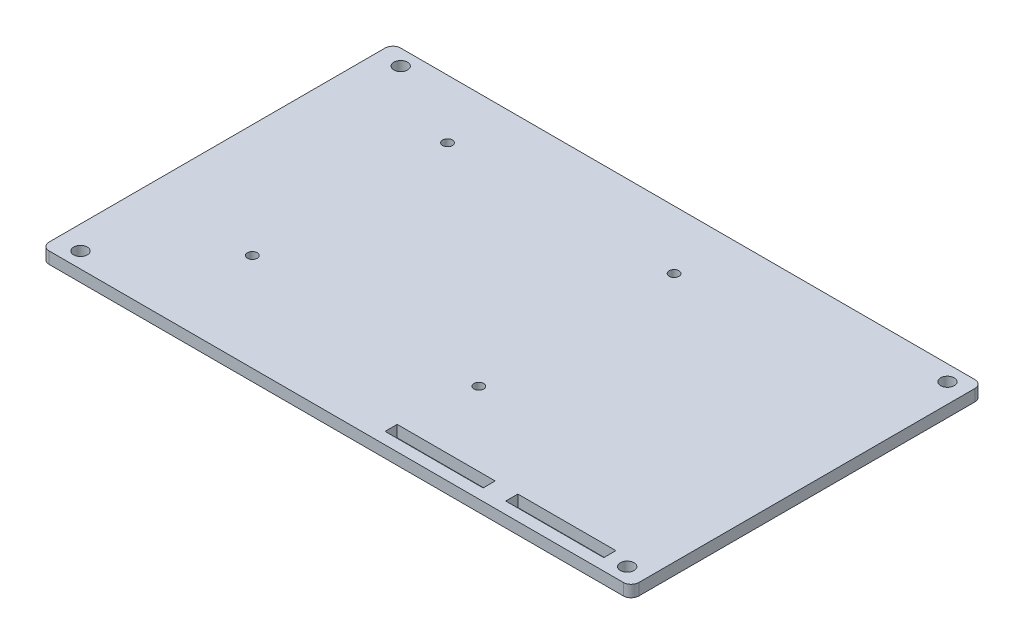
ISO-10303-21;
HEADER;
FILE_DESCRIPTION(('STEP AP214'),'2;1');
FILE_NAME('part.step','',(''),(''),'','','');
FILE_SCHEMA(('AUTOMOTIVE_DESIGN { 1 0 10303 214 1 1 1 1 }'));
ENDSEC;
DATA;
#1=APPLICATION_CONTEXT('core data for automotive mechanical design processes');
#2=APPLICATION_PROTOCOL_DEFINITION('international standard','automotive_design',2000,#1);
#3=PRODUCT_CONTEXT('',#1,'mechanical');
#4=PRODUCT('Part','Part','',(#3));
#5=PRODUCT_RELATED_PRODUCT_CATEGORY('part','',(#4));
#6=PRODUCT_DEFINITION_FORMATION('','',#4);
#7=PRODUCT_DEFINITION_CONTEXT('part definition',#1,'design');
#8=PRODUCT_DEFINITION('design','',#6,#7);
#9=PRODUCT_DEFINITION_SHAPE('','',#8);
#10=(LENGTH_UNIT() NAMED_UNIT(*) SI_UNIT(.MILLI.,.METRE.));
#11=(NAMED_UNIT(*) PLANE_ANGLE_UNIT() SI_UNIT($,.RADIAN.));
#12=(NAMED_UNIT(*) SI_UNIT($,.STERADIAN.) SOLID_ANGLE_UNIT());
#13=UNCERTAINTY_MEASURE_WITH_UNIT(LENGTH_MEASURE(1.E-05),#10,'distance_accuracy_value','');
#14=(GEOMETRIC_REPRESENTATION_CONTEXT(3) GLOBAL_UNCERTAINTY_ASSIGNED_CONTEXT((#13)) GLOBAL_UNIT_ASSIGNED_CONTEXT((#10,
#11,#12)) REPRESENTATION_CONTEXT('',''));
#15=CARTESIAN_POINT('',(0.,0.,0.));
#16=DIRECTION('',(0.,0.,1.));
#17=DIRECTION('',(1.,0.,0.));
#18=AXIS2_PLACEMENT_3D('',#15,#16,#17);
#19=CARTESIAN_POINT('',(0.,3.,0.));
#20=DIRECTION('',(1.,0.,0.));
#21=DIRECTION('',(0.,0.,-1.));
#22=AXIS2_PLACEMENT_3D('',#19,#20,#21);
#23=PLANE('',#22);
#24=DIRECTION('',(0.,0.,1.));
#25=VECTOR('',#24,1.);
#26=CARTESIAN_POINT('',(0.,0.,0.));
#27=LINE('',#26,#25);
#28=CARTESIAN_POINT('',(0.,0.,-88.));
#29=VERTEX_POINT('',#28);
#30=CARTESIAN_POINT('',(0.,0.,-2.));
#31=VERTEX_POINT('',#30);
#32=EDGE_CURVE('E317',#29,#31,#27,.T.);
#33=ORIENTED_EDGE('',*,*,#32,.T.);
#34=DIRECTION('',(0.,-1.,0.));
#35=VECTOR('',#34,1.);
#36=CARTESIAN_POINT('',(0.,3.,-2.));
#37=LINE('',#36,#35);
#38=CARTESIAN_POINT('',(0.,3.,-2.));
#39=VERTEX_POINT('',#38);
#40=EDGE_CURVE('E11',#31,#39,#37,.F.);
#41=ORIENTED_EDGE('',*,*,#40,.T.);
#42=DIRECTION('',(0.,0.,1.));
#43=VECTOR('',#42,1.);
#44=CARTESIAN_POINT('',(0.,3.,0.));
#45=LINE('',#44,#43);
#46=CARTESIAN_POINT('',(0.,3.,-88.));
#47=VERTEX_POINT('',#46);
#48=EDGE_CURVE('E321',#47,#39,#45,.T.);
#49=ORIENTED_EDGE('',*,*,#48,.F.);
#50=DIRECTION('',(0.,-1.,0.));
#51=VECTOR('',#50,1.);
#52=CARTESIAN_POINT('',(0.,3.,-88.));
#53=LINE('',#52,#51);
#54=EDGE_CURVE('E53',#47,#29,#53,.T.);
#55=ORIENTED_EDGE('',*,*,#54,.T.);
#56=EDGE_LOOP('',(#33,#41,#49,#55));
#57=FACE_BOUND('',#56,.T.);
#58=ADVANCED_FACE('F44',(#57),#23,.F.);
#59=CARTESIAN_POINT('',(0.,3.,0.));
#60=DIRECTION('',(0.,0.,-1.));
#61=DIRECTION('',(-1.,0.,0.));
#62=AXIS2_PLACEMENT_3D('',#59,#60,#61);
#63=PLANE('',#62);
#64=DIRECTION('',(1.,0.,0.));
#65=VECTOR('',#64,1.);
#66=CARTESIAN_POINT('',(0.,0.,0.));
#67=LINE('',#66,#65);
#68=CARTESIAN_POINT('',(2.,0.,0.));
#69=VERTEX_POINT('',#68);
#70=CARTESIAN_POINT('',(149.,0.,0.));
#71=VERTEX_POINT('',#70);
#72=EDGE_CURVE('E342',#69,#71,#67,.T.);
#73=ORIENTED_EDGE('',*,*,#72,.T.);
#74=DIRECTION('',(0.,-1.,0.));
#75=VECTOR('',#74,1.);
#76=CARTESIAN_POINT('',(149.,3.,0.));
#77=LINE('',#76,#75);
#78=CARTESIAN_POINT('',(149.,3.,0.));
#79=VERTEX_POINT('',#78);
#80=EDGE_CURVE('E394',#71,#79,#77,.F.);
#81=ORIENTED_EDGE('',*,*,#80,.T.);
#82=DIRECTION('',(1.,0.,0.));
#83=VECTOR('',#82,1.);
#84=CARTESIAN_POINT('',(0.,3.,0.));
#85=LINE('',#84,#83);
#86=CARTESIAN_POINT('',(2.,3.,0.));
#87=VERTEX_POINT('',#86);
#88=EDGE_CURVE('E325',#87,#79,#85,.T.);
#89=ORIENTED_EDGE('',*,*,#88,.F.);
#90=DIRECTION('',(0.,-1.,0.));
#91=VECTOR('',#90,1.);
#92=CARTESIAN_POINT('',(2.,3.,0.));
#93=LINE('',#92,#91);
#94=EDGE_CURVE('E390',#87,#69,#93,.T.);
#95=ORIENTED_EDGE('',*,*,#94,.T.);
#96=EDGE_LOOP('',(#73,#81,#89,#95));
#97=FACE_BOUND('',#96,.T.);
#98=ADVANCED_FACE('F414',(#97),#63,.F.);
#99=CARTESIAN_POINT('',(151.,3.,0.));
#100=DIRECTION('',(-1.,0.,0.));
#101=DIRECTION('',(0.,0.,1.));
#102=AXIS2_PLACEMENT_3D('',#99,#100,#101);
#103=PLANE('',#102);
#104=DIRECTION('',(0.,0.,-1.));
#105=VECTOR('',#104,1.);
#106=CARTESIAN_POINT('',(151.,0.,0.));
#107=LINE('',#106,#105);
#108=CARTESIAN_POINT('',(151.,0.,-2.));
#109=VERTEX_POINT('',#108);
#110=CARTESIAN_POINT('',(151.,0.,-88.));
#111=VERTEX_POINT('',#110);
#112=EDGE_CURVE('E346',#109,#111,#107,.T.);
#113=ORIENTED_EDGE('',*,*,#112,.T.);
#114=DIRECTION('',(0.,-1.,0.));
#115=VECTOR('',#114,1.);
#116=CARTESIAN_POINT('',(151.,3.,-88.));
#117=LINE('',#116,#115);
#118=CARTESIAN_POINT('',(151.,3.,-88.));
#119=VERTEX_POINT('',#118);
#120=EDGE_CURVE('E375',#111,#119,#117,.F.);
#121=ORIENTED_EDGE('',*,*,#120,.T.);
#122=DIRECTION('',(0.,0.,-1.));
#123=VECTOR('',#122,1.);
#124=CARTESIAN_POINT('',(151.,3.,0.));
#125=LINE('',#124,#123);
#126=CARTESIAN_POINT('',(151.,3.,-2.));
#127=VERTEX_POINT('',#126);
#128=EDGE_CURVE('E330',#127,#119,#125,.T.);
#129=ORIENTED_EDGE('',*,*,#128,.F.);
#130=DIRECTION('',(0.,-1.,0.));
#131=VECTOR('',#130,1.);
#132=CARTESIAN_POINT('',(151.,3.,-2.));
#133=LINE('',#132,#131);
#134=EDGE_CURVE('E371',#127,#109,#133,.T.);
#135=ORIENTED_EDGE('',*,*,#134,.T.);
#136=EDGE_LOOP('',(#113,#121,#129,#135));
#137=FACE_BOUND('',#136,.T.);
#138=ADVANCED_FACE('F425',(#137),#103,.F.);
#139=CARTESIAN_POINT('',(0.,3.,-90.));
#140=DIRECTION('',(0.,0.,1.));
#141=DIRECTION('',(1.,0.,0.));
#142=AXIS2_PLACEMENT_3D('',#139,#140,#141);
#143=PLANE('',#142);
#144=DIRECTION('',(-1.,0.,0.));
#145=VECTOR('',#144,1.);
#146=CARTESIAN_POINT('',(0.,3.,-90.));
#147=LINE('',#146,#145);
#148=CARTESIAN_POINT('',(149.,3.,-90.));
#149=VERTEX_POINT('',#148);
#150=CARTESIAN_POINT('',(2.,3.,-90.));
#151=VERTEX_POINT('',#150);
#152=EDGE_CURVE('E334',#149,#151,#147,.T.);
#153=ORIENTED_EDGE('',*,*,#152,.F.);
#154=DIRECTION('',(0.,-1.,0.));
#155=VECTOR('',#154,1.);
#156=CARTESIAN_POINT('',(149.,3.,-90.));
#157=LINE('',#156,#155);
#158=CARTESIAN_POINT('',(149.,0.,-90.));
#159=VERTEX_POINT('',#158);
#160=EDGE_CURVE('E355',#149,#159,#157,.T.);
#161=ORIENTED_EDGE('',*,*,#160,.T.);
#162=DIRECTION('',(-1.,0.,0.));
#163=VECTOR('',#162,1.);
#164=CARTESIAN_POINT('',(0.,0.,-90.));
#165=LINE('',#164,#163);
#166=CARTESIAN_POINT('',(2.,0.,-90.));
#167=VERTEX_POINT('',#166);
#168=EDGE_CURVE('E326',#159,#167,#165,.T.);
#169=ORIENTED_EDGE('',*,*,#168,.T.);
#170=DIRECTION('',(0.,-1.,0.));
#171=VECTOR('',#170,1.);
#172=CARTESIAN_POINT('',(2.,3.,-90.));
#173=LINE('',#172,#171);
#174=EDGE_CURVE('E338',#167,#151,#173,.F.);
#175=ORIENTED_EDGE('',*,*,#174,.T.);
#176=EDGE_LOOP('',(#153,#161,#169,#175));
#177=FACE_BOUND('',#176,.T.);
#178=ADVANCED_FACE('F433',(#177),#143,.F.);
#179=CARTESIAN_POINT('',(0.,3.,0.));
#180=DIRECTION('',(0.,-1.,0.));
#181=DIRECTION('',(0.,0.,-1.));
#182=AXIS2_PLACEMENT_3D('',#179,#180,#181);
#183=PLANE('',#182);
#184=DIRECTION('',(-1.,0.,0.));
#185=VECTOR('',#184,1.);
#186=CARTESIAN_POINT('',(0.,3.,-3.));
#187=LINE('',#186,#185);
#188=CARTESIAN_POINT('',(110.1,3.,-3.));
#189=VERTEX_POINT('',#188);
#190=CARTESIAN_POINT('',(85.,3.,-3.));
#191=VERTEX_POINT('',#190);
#192=EDGE_CURVE('E243',#189,#191,#187,.T.);
#193=ORIENTED_EDGE('',*,*,#192,.T.);
#194=DIRECTION('',(0.,0.,-1.));
#195=VECTOR('',#194,1.);
#196=CARTESIAN_POINT('',(85.,3.,0.));
#197=LINE('',#196,#195);
#198=CARTESIAN_POINT('',(85.,3.,-6.1));
#199=VERTEX_POINT('',#198);
#200=EDGE_CURVE('E162',#191,#199,#197,.T.);
#201=ORIENTED_EDGE('',*,*,#200,.T.);
#202=DIRECTION('',(1.,0.,0.));
#203=VECTOR('',#202,1.);
#204=CARTESIAN_POINT('',(0.,3.,-6.1));
#205=LINE('',#204,#203);
#206=CARTESIAN_POINT('',(110.1,3.,-6.1));
#207=VERTEX_POINT('',#206);
#208=EDGE_CURVE('E250',#199,#207,#205,.T.);
#209=ORIENTED_EDGE('',*,*,#208,.T.);
#210=DIRECTION('',(0.,0.,1.));
#211=VECTOR('',#210,1.);
#212=CARTESIAN_POINT('',(110.1,3.,0.));
#213=LINE('',#212,#211);
#214=EDGE_CURVE('E246',#207,#189,#213,.T.);
#215=ORIENTED_EDGE('',*,*,#214,.T.);
#216=EDGE_LOOP('',(#193,#201,#209,#215));
#217=FACE_BOUND('',#216,.T.);
#218=DIRECTION('',(1.,0.,0.));
#219=VECTOR('',#218,1.);
#220=CARTESIAN_POINT('',(0.,3.,-6.09999999999998));
#221=LINE('',#220,#219);
#222=CARTESIAN_POINT('',(115.9,3.,-6.1));
#223=VERTEX_POINT('',#222);
#224=CARTESIAN_POINT('',(141.,3.,-6.1));
#225=VERTEX_POINT('',#224);
#226=EDGE_CURVE('E196',#223,#225,#221,.T.);
#227=ORIENTED_EDGE('',*,*,#226,.T.);
#228=DIRECTION('',(0.,0.,1.));
#229=VECTOR('',#228,1.);
#230=CARTESIAN_POINT('',(141.,3.,0.));
#231=LINE('',#230,#229);
#232=CARTESIAN_POINT('',(141.,3.,-3.));
#233=VERTEX_POINT('',#232);
#234=EDGE_CURVE('E239',#225,#233,#231,.T.);
#235=ORIENTED_EDGE('',*,*,#234,.T.);
#236=DIRECTION('',(-1.,0.,0.));
#237=VECTOR('',#236,1.);
#238=CARTESIAN_POINT('',(0.,3.,-2.99999999999998));
#239=LINE('',#238,#237);
#240=CARTESIAN_POINT('',(115.9,3.,-3.));
#241=VERTEX_POINT('',#240);
#242=EDGE_CURVE('E235',#233,#241,#239,.T.);
#243=ORIENTED_EDGE('',*,*,#242,.T.);
#244=DIRECTION('',(0.,0.,-1.));
#245=VECTOR('',#244,1.);
#246=CARTESIAN_POINT('',(115.9,3.,0.));
#247=LINE('',#246,#245);
#248=EDGE_CURVE('E231',#241,#223,#247,.T.);
#249=ORIENTED_EDGE('',*,*,#248,.T.);
#250=EDGE_LOOP('',(#227,#235,#243,#249));
#251=FACE_BOUND('',#250,.T.);
#252=CARTESIAN_POINT('',(87.,3.,-25.));
#253=DIRECTION('',(0.,1.,0.));
#254=DIRECTION('',(0.,0.,1.));
#255=AXIS2_PLACEMENT_3D('',#252,#253,#254);
#256=CIRCLE('',#255,1.25);
#257=CARTESIAN_POINT('',(87.,3.,-23.75));
#258=VERTEX_POINT('',#257);
#259=EDGE_CURVE('E265',#258,#258,#256,.T.);
#260=ORIENTED_EDGE('',*,*,#259,.F.);
#261=EDGE_LOOP('',(#260));
#262=FACE_BOUND('',#261,.T.);
#263=CARTESIAN_POINT('',(29.,3.,-75.));
#264=DIRECTION('',(0.,1.,0.));
#265=DIRECTION('',(0.,0.,1.));
#266=AXIS2_PLACEMENT_3D('',#263,#264,#265);
#267=CIRCLE('',#266,1.25);
#268=CARTESIAN_POINT('',(29.,3.,-73.75));
#269=VERTEX_POINT('',#268);
#270=EDGE_CURVE('E274',#269,#269,#267,.T.);
#271=ORIENTED_EDGE('',*,*,#270,.F.);
#272=EDGE_LOOP('',(#271));
#273=FACE_BOUND('',#272,.T.);
#274=CARTESIAN_POINT('',(29.,3.,-25.));
#275=DIRECTION('',(0.,1.,0.));
#276=DIRECTION('',(0.,0.,1.));
#277=AXIS2_PLACEMENT_3D('',#274,#275,#276);
#278=CIRCLE('',#277,1.25);
#279=CARTESIAN_POINT('',(29.,3.,-23.75));
#280=VERTEX_POINT('',#279);
#281=EDGE_CURVE('E257',#280,#280,#278,.T.);
#282=ORIENTED_EDGE('',*,*,#281,.F.);
#283=EDGE_LOOP('',(#282));
#284=FACE_BOUND('',#283,.T.);
#285=CARTESIAN_POINT('',(87.,3.,-75.));
#286=DIRECTION('',(0.,1.,0.));
#287=DIRECTION('',(0.,0.,1.));
#288=AXIS2_PLACEMENT_3D('',#285,#286,#287);
#289=CIRCLE('',#288,1.25);
#290=CARTESIAN_POINT('',(87.,3.,-73.75));
#291=VERTEX_POINT('',#290);
#292=EDGE_CURVE('E269',#291,#291,#289,.T.);
#293=ORIENTED_EDGE('',*,*,#292,.F.);
#294=EDGE_LOOP('',(#293));
#295=FACE_BOUND('',#294,.T.);
#296=CARTESIAN_POINT('',(146.,3.,-4.));
#297=DIRECTION('',(0.,1.,0.));
#298=DIRECTION('',(0.,0.,1.));
#299=AXIS2_PLACEMENT_3D('',#296,#297,#298);
#300=CIRCLE('',#299,1.75000000000001);
#301=CARTESIAN_POINT('',(146.,3.,-2.24999999999999));
#302=VERTEX_POINT('',#301);
#303=EDGE_CURVE('E297',#302,#302,#300,.T.);
#304=ORIENTED_EDGE('',*,*,#303,.F.);
#305=EDGE_LOOP('',(#304));
#306=FACE_BOUND('',#305,.T.);
#307=CARTESIAN_POINT('',(6.,3.,-86.));
#308=DIRECTION('',(0.,1.,0.));
#309=DIRECTION('',(0.,0.,1.));
#310=AXIS2_PLACEMENT_3D('',#307,#308,#309);
#311=CIRCLE('',#310,1.75);
#312=CARTESIAN_POINT('',(6.,3.,-84.25));
#313=VERTEX_POINT('',#312);
#314=EDGE_CURVE('E306',#313,#313,#311,.T.);
#315=ORIENTED_EDGE('',*,*,#314,.F.);
#316=EDGE_LOOP('',(#315));
#317=FACE_BOUND('',#316,.T.);
#318=CARTESIAN_POINT('',(6.,3.,-4.));
#319=DIRECTION('',(0.,1.,0.));
#320=DIRECTION('',(0.,0.,1.));
#321=AXIS2_PLACEMENT_3D('',#318,#319,#320);
#322=CIRCLE('',#321,1.75);
#323=CARTESIAN_POINT('',(6.,3.,-2.25));
#324=VERTEX_POINT('',#323);
#325=EDGE_CURVE('E289',#324,#324,#322,.T.);
#326=ORIENTED_EDGE('',*,*,#325,.F.);
#327=EDGE_LOOP('',(#326));
#328=FACE_BOUND('',#327,.T.);
#329=CARTESIAN_POINT('',(146.,3.,-86.));
#330=DIRECTION('',(0.,1.,0.));
#331=DIRECTION('',(0.,0.,1.));
#332=AXIS2_PLACEMENT_3D('',#329,#330,#331);
#333=CIRCLE('',#332,1.75000000000001);
#334=CARTESIAN_POINT('',(146.,3.,-84.25));
#335=VERTEX_POINT('',#334);
#336=EDGE_CURVE('E301',#335,#335,#333,.T.);
#337=ORIENTED_EDGE('',*,*,#336,.F.);
#338=EDGE_LOOP('',(#337));
#339=FACE_BOUND('',#338,.T.);
#340=ORIENTED_EDGE('',*,*,#128,.T.);
#341=CARTESIAN_POINT('',(149.,3.,-88.));
#342=DIRECTION('',(0.,-1.,0.));
#343=DIRECTION('',(0.,0.,-1.));
#344=AXIS2_PLACEMENT_3D('',#341,#342,#343);
#345=CIRCLE('',#344,2.);
#346=EDGE_CURVE('E387',#119,#149,#345,.F.);
#347=ORIENTED_EDGE('',*,*,#346,.T.);
#348=ORIENTED_EDGE('',*,*,#152,.T.);
#349=CARTESIAN_POINT('',(2.,3.,-88.));
#350=DIRECTION('',(0.,-1.,0.));
#351=DIRECTION('',(0.,0.,-1.));
#352=AXIS2_PLACEMENT_3D('',#349,#350,#351);
#353=CIRCLE('',#352,2.);
#354=EDGE_CURVE('E378',#151,#47,#353,.F.);
#355=ORIENTED_EDGE('',*,*,#354,.T.);
#356=ORIENTED_EDGE('',*,*,#48,.T.);
#357=CARTESIAN_POINT('',(2.,3.,-2.));
#358=DIRECTION('',(0.,-1.,0.));
#359=DIRECTION('',(0.,0.,-1.));
#360=AXIS2_PLACEMENT_3D('',#357,#358,#359);
#361=CIRCLE('',#360,2.);
#362=EDGE_CURVE('E381',#39,#87,#361,.F.);
#363=ORIENTED_EDGE('',*,*,#362,.T.);
#364=ORIENTED_EDGE('',*,*,#88,.T.);
#365=CARTESIAN_POINT('',(149.,3.,-2.));
#366=DIRECTION('',(0.,-1.,0.));
#367=DIRECTION('',(0.,0.,-1.));
#368=AXIS2_PLACEMENT_3D('',#365,#366,#367);
#369=CIRCLE('',#368,2.);
#370=EDGE_CURVE('E384',#79,#127,#369,.F.);
#371=ORIENTED_EDGE('',*,*,#370,.T.);
#372=EDGE_LOOP('',(#340,#347,#348,#355,#356,#363,#364,#371));
#373=FACE_BOUND('',#372,.T.);
#374=ADVANCED_FACE('F418',(#217,#251,#262,#273,#284,#295,#306,#317,#328,#339,#373),#183,.F.);
#375=CARTESIAN_POINT('',(0.,0.,0.));
#376=DIRECTION('',(0.,-1.,0.));
#377=DIRECTION('',(0.,0.,-1.));
#378=AXIS2_PLACEMENT_3D('',#375,#376,#377);
#379=PLANE('',#378);
#380=DIRECTION('',(0.,0.,1.));
#381=VECTOR('',#380,1.);
#382=CARTESIAN_POINT('',(85.,0.,-3.));
#383=LINE('',#382,#381);
#384=CARTESIAN_POINT('',(85.,0.,-6.1));
#385=VERTEX_POINT('',#384);
#386=CARTESIAN_POINT('',(85.,0.,-3.));
#387=VERTEX_POINT('',#386);
#388=EDGE_CURVE('E159',#385,#387,#383,.T.);
#389=ORIENTED_EDGE('',*,*,#388,.T.);
#390=DIRECTION('',(1.,0.,0.));
#391=VECTOR('',#390,1.);
#392=CARTESIAN_POINT('',(85.,0.,-3.));
#393=LINE('',#392,#391);
#394=CARTESIAN_POINT('',(110.1,0.,-3.));
#395=VERTEX_POINT('',#394);
#396=EDGE_CURVE('E170',#387,#395,#393,.T.);
#397=ORIENTED_EDGE('',*,*,#396,.T.);
#398=DIRECTION('',(0.,0.,-1.));
#399=VECTOR('',#398,1.);
#400=CARTESIAN_POINT('',(110.1,0.,-3.));
#401=LINE('',#400,#399);
#402=CARTESIAN_POINT('',(110.1,0.,-6.1));
#403=VERTEX_POINT('',#402);
#404=EDGE_CURVE('E176',#395,#403,#401,.T.);
#405=ORIENTED_EDGE('',*,*,#404,.T.);
#406=DIRECTION('',(-1.,0.,0.));
#407=VECTOR('',#406,1.);
#408=CARTESIAN_POINT('',(85.,0.,-6.1));
#409=LINE('',#408,#407);
#410=EDGE_CURVE('E166',#403,#385,#409,.T.);
#411=ORIENTED_EDGE('',*,*,#410,.T.);
#412=EDGE_LOOP('',(#389,#397,#405,#411));
#413=FACE_BOUND('',#412,.T.);
#414=DIRECTION('',(0.,0.,-1.));
#415=VECTOR('',#414,1.);
#416=CARTESIAN_POINT('',(141.,0.,-3.));
#417=LINE('',#416,#415);
#418=CARTESIAN_POINT('',(141.,0.,-3.));
#419=VERTEX_POINT('',#418);
#420=CARTESIAN_POINT('',(141.,0.,-6.1));
#421=VERTEX_POINT('',#420);
#422=EDGE_CURVE('E182',#419,#421,#417,.T.);
#423=ORIENTED_EDGE('',*,*,#422,.T.);
#424=DIRECTION('',(-1.,0.,0.));
#425=VECTOR('',#424,1.);
#426=CARTESIAN_POINT('',(141.,0.,-6.1));
#427=LINE('',#426,#425);
#428=CARTESIAN_POINT('',(115.9,0.,-6.1));
#429=VERTEX_POINT('',#428);
#430=EDGE_CURVE('E186',#421,#429,#427,.T.);
#431=ORIENTED_EDGE('',*,*,#430,.T.);
#432=DIRECTION('',(0.,0.,1.));
#433=VECTOR('',#432,1.);
#434=CARTESIAN_POINT('',(115.9,0.,-3.));
#435=LINE('',#434,#433);
#436=CARTESIAN_POINT('',(115.9,0.,-3.));
#437=VERTEX_POINT('',#436);
#438=EDGE_CURVE('E221',#429,#437,#435,.T.);
#439=ORIENTED_EDGE('',*,*,#438,.T.);
#440=DIRECTION('',(1.,0.,0.));
#441=VECTOR('',#440,1.);
#442=CARTESIAN_POINT('',(141.,0.,-3.));
#443=LINE('',#442,#441);
#444=EDGE_CURVE('E205',#437,#419,#443,.T.);
#445=ORIENTED_EDGE('',*,*,#444,.T.);
#446=EDGE_LOOP('',(#423,#431,#439,#445));
#447=FACE_BOUND('',#446,.T.);
#448=CARTESIAN_POINT('',(87.,0.,-25.));
#449=DIRECTION('',(0.,1.,0.));
#450=DIRECTION('',(0.,0.,1.));
#451=AXIS2_PLACEMENT_3D('',#448,#449,#450);
#452=CIRCLE('',#451,1.25);
#453=CARTESIAN_POINT('',(87.,0.,-23.75));
#454=VERTEX_POINT('',#453);
#455=EDGE_CURVE('E270',#454,#454,#452,.T.);
#456=ORIENTED_EDGE('',*,*,#455,.T.);
#457=EDGE_LOOP('',(#456));
#458=FACE_BOUND('',#457,.T.);
#459=CARTESIAN_POINT('',(29.,0.,-75.));
#460=DIRECTION('',(0.,1.,0.));
#461=DIRECTION('',(0.,0.,1.));
#462=AXIS2_PLACEMENT_3D('',#459,#460,#461);
#463=CIRCLE('',#462,1.25);
#464=CARTESIAN_POINT('',(29.,0.,-73.75));
#465=VERTEX_POINT('',#464);
#466=EDGE_CURVE('E261',#465,#465,#463,.T.);
#467=ORIENTED_EDGE('',*,*,#466,.T.);
#468=EDGE_LOOP('',(#467));
#469=FACE_BOUND('',#468,.T.);
#470=CARTESIAN_POINT('',(29.,0.,-25.));
#471=DIRECTION('',(0.,1.,0.));
#472=DIRECTION('',(0.,0.,1.));
#473=AXIS2_PLACEMENT_3D('',#470,#471,#472);
#474=CIRCLE('',#473,1.25);
#475=CARTESIAN_POINT('',(29.,0.,-23.75));
#476=VERTEX_POINT('',#475);
#477=EDGE_CURVE('E256',#476,#476,#474,.T.);
#478=ORIENTED_EDGE('',*,*,#477,.T.);
#479=EDGE_LOOP('',(#478));
#480=FACE_BOUND('',#479,.T.);
#481=CARTESIAN_POINT('',(87.,0.,-75.));
#482=DIRECTION('',(0.,1.,0.));
#483=DIRECTION('',(0.,0.,1.));
#484=AXIS2_PLACEMENT_3D('',#481,#482,#483);
#485=CIRCLE('',#484,1.25);
#486=CARTESIAN_POINT('',(87.,0.,-73.75));
#487=VERTEX_POINT('',#486);
#488=EDGE_CURVE('E281',#487,#487,#485,.T.);
#489=ORIENTED_EDGE('',*,*,#488,.T.);
#490=EDGE_LOOP('',(#489));
#491=FACE_BOUND('',#490,.T.);
#492=CARTESIAN_POINT('',(146.,0.,-4.));
#493=DIRECTION('',(0.,1.,0.));
#494=DIRECTION('',(0.,0.,1.));
#495=AXIS2_PLACEMENT_3D('',#492,#493,#494);
#496=CIRCLE('',#495,1.75000000000001);
#497=CARTESIAN_POINT('',(146.,0.,-2.24999999999999));
#498=VERTEX_POINT('',#497);
#499=EDGE_CURVE('E302',#498,#498,#496,.T.);
#500=ORIENTED_EDGE('',*,*,#499,.T.);
#501=EDGE_LOOP('',(#500));
#502=FACE_BOUND('',#501,.T.);
#503=CARTESIAN_POINT('',(6.,0.,-86.));
#504=DIRECTION('',(0.,1.,0.));
#505=DIRECTION('',(0.,0.,1.));
#506=AXIS2_PLACEMENT_3D('',#503,#504,#505);
#507=CIRCLE('',#506,1.75);
#508=CARTESIAN_POINT('',(6.,0.,-84.25));
#509=VERTEX_POINT('',#508);
#510=EDGE_CURVE('E293',#509,#509,#507,.T.);
#511=ORIENTED_EDGE('',*,*,#510,.T.);
#512=EDGE_LOOP('',(#511));
#513=FACE_BOUND('',#512,.T.);
#514=CARTESIAN_POINT('',(6.,0.,-4.));
#515=DIRECTION('',(0.,1.,0.));
#516=DIRECTION('',(0.,0.,1.));
#517=AXIS2_PLACEMENT_3D('',#514,#515,#516);
#518=CIRCLE('',#517,1.75);
#519=CARTESIAN_POINT('',(6.,0.,-2.25));
#520=VERTEX_POINT('',#519);
#521=EDGE_CURVE('E285',#520,#520,#518,.T.);
#522=ORIENTED_EDGE('',*,*,#521,.T.);
#523=EDGE_LOOP('',(#522));
#524=FACE_BOUND('',#523,.T.);
#525=CARTESIAN_POINT('',(146.,0.,-86.));
#526=DIRECTION('',(0.,1.,0.));
#527=DIRECTION('',(0.,0.,1.));
#528=AXIS2_PLACEMENT_3D('',#525,#526,#527);
#529=CIRCLE('',#528,1.75000000000001);
#530=CARTESIAN_POINT('',(146.,0.,-84.25));
#531=VERTEX_POINT('',#530);
#532=EDGE_CURVE('E313',#531,#531,#529,.T.);
#533=ORIENTED_EDGE('',*,*,#532,.T.);
#534=EDGE_LOOP('',(#533));
#535=FACE_BOUND('',#534,.T.);
#536=ORIENTED_EDGE('',*,*,#168,.F.);
#537=CARTESIAN_POINT('',(149.,0.,-88.));
#538=DIRECTION('',(0.,-1.,0.));
#539=DIRECTION('',(0.,0.,-1.));
#540=AXIS2_PLACEMENT_3D('',#537,#538,#539);
#541=CIRCLE('',#540,2.);
#542=EDGE_CURVE('E368',#159,#111,#541,.T.);
#543=ORIENTED_EDGE('',*,*,#542,.T.);
#544=ORIENTED_EDGE('',*,*,#112,.F.);
#545=CARTESIAN_POINT('',(149.,0.,-2.));
#546=DIRECTION('',(0.,-1.,0.));
#547=DIRECTION('',(0.,0.,-1.));
#548=AXIS2_PLACEMENT_3D('',#545,#546,#547);
#549=CIRCLE('',#548,2.);
#550=EDGE_CURVE('E365',#109,#71,#549,.T.);
#551=ORIENTED_EDGE('',*,*,#550,.T.);
#552=ORIENTED_EDGE('',*,*,#72,.F.);
#553=CARTESIAN_POINT('',(2.,0.,-2.));
#554=DIRECTION('',(0.,-1.,0.));
#555=DIRECTION('',(0.,0.,-1.));
#556=AXIS2_PLACEMENT_3D('',#553,#554,#555);
#557=CIRCLE('',#556,2.);
#558=EDGE_CURVE('E362',#69,#31,#557,.T.);
#559=ORIENTED_EDGE('',*,*,#558,.T.);
#560=ORIENTED_EDGE('',*,*,#32,.F.);
#561=CARTESIAN_POINT('',(2.,0.,-88.));
#562=DIRECTION('',(0.,-1.,0.));
#563=DIRECTION('',(0.,0.,-1.));
#564=AXIS2_PLACEMENT_3D('',#561,#562,#563);
#565=CIRCLE('',#564,2.);
#566=EDGE_CURVE('E359',#29,#167,#565,.T.);
#567=ORIENTED_EDGE('',*,*,#566,.T.);
#568=EDGE_LOOP('',(#536,#543,#544,#551,#552,#559,#560,#567));
#569=FACE_BOUND('',#568,.T.);
#570=ADVANCED_FACE('F178',(#413,#447,#458,#469,#480,#491,#502,#513,#524,#535,#569),#379,.T.);
#571=CARTESIAN_POINT('',(146.,0.,-86.));
#572=DIRECTION('',(0.,1.,0.));
#573=DIRECTION('',(0.,0.,1.));
#574=AXIS2_PLACEMENT_3D('',#571,#572,#573);
#575=CYLINDRICAL_SURFACE('',#574,1.75000000000001);
#576=ORIENTED_EDGE('',*,*,#532,.F.);
#577=EDGE_LOOP('',(#576));
#578=FACE_BOUND('',#577,.T.);
#579=ORIENTED_EDGE('',*,*,#336,.T.);
#580=EDGE_LOOP('',(#579));
#581=FACE_BOUND('',#580,.T.);
#582=ADVANCED_FACE('F592',(#578,#581),#575,.F.);
#583=CARTESIAN_POINT('',(6.,0.,-4.));
#584=DIRECTION('',(0.,1.,0.));
#585=DIRECTION('',(0.,0.,1.));
#586=AXIS2_PLACEMENT_3D('',#583,#584,#585);
#587=CYLINDRICAL_SURFACE('',#586,1.75);
#588=ORIENTED_EDGE('',*,*,#521,.F.);
#589=EDGE_LOOP('',(#588));
#590=FACE_BOUND('',#589,.T.);
#591=ORIENTED_EDGE('',*,*,#325,.T.);
#592=EDGE_LOOP('',(#591));
#593=FACE_BOUND('',#592,.T.);
#594=ADVANCED_FACE('F588',(#590,#593),#587,.F.);
#595=CARTESIAN_POINT('',(6.,0.,-86.));
#596=DIRECTION('',(0.,1.,0.));
#597=DIRECTION('',(0.,0.,1.));
#598=AXIS2_PLACEMENT_3D('',#595,#596,#597);
#599=CYLINDRICAL_SURFACE('',#598,1.75);
#600=ORIENTED_EDGE('',*,*,#510,.F.);
#601=EDGE_LOOP('',(#600));
#602=FACE_BOUND('',#601,.T.);
#603=ORIENTED_EDGE('',*,*,#314,.T.);
#604=EDGE_LOOP('',(#603));
#605=FACE_BOUND('',#604,.T.);
#606=ADVANCED_FACE('F591',(#602,#605),#599,.F.);
#607=CARTESIAN_POINT('',(146.,0.,-4.));
#608=DIRECTION('',(0.,1.,0.));
#609=DIRECTION('',(0.,0.,1.));
#610=AXIS2_PLACEMENT_3D('',#607,#608,#609);
#611=CYLINDRICAL_SURFACE('',#610,1.75000000000001);
#612=ORIENTED_EDGE('',*,*,#499,.F.);
#613=EDGE_LOOP('',(#612));
#614=FACE_BOUND('',#613,.T.);
#615=ORIENTED_EDGE('',*,*,#303,.T.);
#616=EDGE_LOOP('',(#615));
#617=FACE_BOUND('',#616,.T.);
#618=ADVANCED_FACE('F455',(#614,#617),#611,.F.);
#619=CARTESIAN_POINT('',(149.,3.,-88.));
#620=DIRECTION('',(0.,-1.,0.));
#621=DIRECTION('',(0.,0.,-1.));
#622=AXIS2_PLACEMENT_3D('',#619,#620,#621);
#623=CYLINDRICAL_SURFACE('',#622,2.);
#624=ORIENTED_EDGE('',*,*,#346,.F.);
#625=ORIENTED_EDGE('',*,*,#120,.F.);
#626=ORIENTED_EDGE('',*,*,#542,.F.);
#627=ORIENTED_EDGE('',*,*,#160,.F.);
#628=EDGE_LOOP('',(#624,#625,#626,#627));
#629=FACE_BOUND('',#628,.T.);
#630=ADVANCED_FACE('F430',(#629),#623,.T.);
#631=CARTESIAN_POINT('',(149.,3.,-2.));
#632=DIRECTION('',(0.,-1.,0.));
#633=DIRECTION('',(0.,0.,-1.));
#634=AXIS2_PLACEMENT_3D('',#631,#632,#633);
#635=CYLINDRICAL_SURFACE('',#634,2.);
#636=ORIENTED_EDGE('',*,*,#370,.F.);
#637=ORIENTED_EDGE('',*,*,#80,.F.);
#638=ORIENTED_EDGE('',*,*,#550,.F.);
#639=ORIENTED_EDGE('',*,*,#134,.F.);
#640=EDGE_LOOP('',(#636,#637,#638,#639));
#641=FACE_BOUND('',#640,.T.);
#642=ADVANCED_FACE('F422',(#641),#635,.T.);
#643=CARTESIAN_POINT('',(2.,3.,-2.));
#644=DIRECTION('',(0.,-1.,0.));
#645=DIRECTION('',(0.,0.,-1.));
#646=AXIS2_PLACEMENT_3D('',#643,#644,#645);
#647=CYLINDRICAL_SURFACE('',#646,2.);
#648=ORIENTED_EDGE('',*,*,#362,.F.);
#649=ORIENTED_EDGE('',*,*,#40,.F.);
#650=ORIENTED_EDGE('',*,*,#558,.F.);
#651=ORIENTED_EDGE('',*,*,#94,.F.);
#652=EDGE_LOOP('',(#648,#649,#650,#651));
#653=FACE_BOUND('',#652,.T.);
#654=ADVANCED_FACE('F411',(#653),#647,.T.);
#655=CARTESIAN_POINT('',(2.,3.,-88.));
#656=DIRECTION('',(0.,-1.,0.));
#657=DIRECTION('',(0.,0.,-1.));
#658=AXIS2_PLACEMENT_3D('',#655,#656,#657);
#659=CYLINDRICAL_SURFACE('',#658,2.);
#660=ORIENTED_EDGE('',*,*,#354,.F.);
#661=ORIENTED_EDGE('',*,*,#174,.F.);
#662=ORIENTED_EDGE('',*,*,#566,.F.);
#663=ORIENTED_EDGE('',*,*,#54,.F.);
#664=EDGE_LOOP('',(#660,#661,#662,#663));
#665=FACE_BOUND('',#664,.T.);
#666=ADVANCED_FACE('F46',(#665),#659,.T.);
#667=CARTESIAN_POINT('',(87.,0.,-75.));
#668=DIRECTION('',(0.,1.,0.));
#669=DIRECTION('',(0.,0.,1.));
#670=AXIS2_PLACEMENT_3D('',#667,#668,#669);
#671=CYLINDRICAL_SURFACE('',#670,1.25);
#672=ORIENTED_EDGE('',*,*,#488,.F.);
#673=EDGE_LOOP('',(#672));
#674=FACE_BOUND('',#673,.T.);
#675=ORIENTED_EDGE('',*,*,#292,.T.);
#676=EDGE_LOOP('',(#675));
#677=FACE_BOUND('',#676,.T.);
#678=ADVANCED_FACE('F436',(#674,#677),#671,.F.);
#679=CARTESIAN_POINT('',(29.,0.,-25.));
#680=DIRECTION('',(0.,1.,0.));
#681=DIRECTION('',(0.,0.,1.));
#682=AXIS2_PLACEMENT_3D('',#679,#680,#681);
#683=CYLINDRICAL_SURFACE('',#682,1.25);
#684=ORIENTED_EDGE('',*,*,#477,.F.);
#685=EDGE_LOOP('',(#684));
#686=FACE_BOUND('',#685,.T.);
#687=ORIENTED_EDGE('',*,*,#281,.T.);
#688=EDGE_LOOP('',(#687));
#689=FACE_BOUND('',#688,.T.);
#690=ADVANCED_FACE('F441',(#686,#689),#683,.F.);
#691=CARTESIAN_POINT('',(29.,0.,-75.));
#692=DIRECTION('',(0.,1.,0.));
#693=DIRECTION('',(0.,0.,1.));
#694=AXIS2_PLACEMENT_3D('',#691,#692,#693);
#695=CYLINDRICAL_SURFACE('',#694,1.25);
#696=ORIENTED_EDGE('',*,*,#466,.F.);
#697=EDGE_LOOP('',(#696));
#698=FACE_BOUND('',#697,.T.);
#699=ORIENTED_EDGE('',*,*,#270,.T.);
#700=EDGE_LOOP('',(#699));
#701=FACE_BOUND('',#700,.T.);
#702=ADVANCED_FACE('F487',(#698,#701),#695,.F.);
#703=CARTESIAN_POINT('',(87.,0.,-25.));
#704=DIRECTION('',(0.,1.,0.));
#705=DIRECTION('',(0.,0.,1.));
#706=AXIS2_PLACEMENT_3D('',#703,#704,#705);
#707=CYLINDRICAL_SURFACE('',#706,1.25);
#708=ORIENTED_EDGE('',*,*,#455,.F.);
#709=EDGE_LOOP('',(#708));
#710=FACE_BOUND('',#709,.T.);
#711=ORIENTED_EDGE('',*,*,#259,.T.);
#712=EDGE_LOOP('',(#711));
#713=FACE_BOUND('',#712,.T.);
#714=ADVANCED_FACE('F497',(#710,#713),#707,.F.);
#715=CARTESIAN_POINT('',(141.,0.,-3.));
#716=DIRECTION('',(1.,0.,0.));
#717=DIRECTION('',(0.,0.,-1.));
#718=AXIS2_PLACEMENT_3D('',#715,#716,#717);
#719=PLANE('',#718);
#720=DIRECTION('',(0.,1.,0.));
#721=VECTOR('',#720,1.);
#722=CARTESIAN_POINT('',(141.,0.,-6.1));
#723=LINE('',#722,#721);
#724=EDGE_CURVE('E68',#421,#225,#723,.T.);
#725=ORIENTED_EDGE('',*,*,#724,.F.);
#726=ORIENTED_EDGE('',*,*,#422,.F.);
#727=DIRECTION('',(0.,1.,0.));
#728=VECTOR('',#727,1.);
#729=CARTESIAN_POINT('',(141.,0.,-3.));
#730=LINE('',#729,#728);
#731=EDGE_CURVE('E214',#419,#233,#730,.T.);
#732=ORIENTED_EDGE('',*,*,#731,.T.);
#733=ORIENTED_EDGE('',*,*,#234,.F.);
#734=EDGE_LOOP('',(#725,#726,#732,#733));
#735=FACE_BOUND('',#734,.T.);
#736=ADVANCED_FACE('F507',(#735),#719,.F.);
#737=CARTESIAN_POINT('',(141.,0.,-3.));
#738=DIRECTION('',(0.,0.,1.));
#739=DIRECTION('',(1.,0.,0.));
#740=AXIS2_PLACEMENT_3D('',#737,#738,#739);
#741=PLANE('',#740);
#742=ORIENTED_EDGE('',*,*,#731,.F.);
#743=ORIENTED_EDGE('',*,*,#444,.F.);
#744=DIRECTION('',(0.,1.,0.));
#745=VECTOR('',#744,1.);
#746=CARTESIAN_POINT('',(115.9,0.,-3.));
#747=LINE('',#746,#745);
#748=EDGE_CURVE('E210',#437,#241,#747,.T.);
#749=ORIENTED_EDGE('',*,*,#748,.T.);
#750=ORIENTED_EDGE('',*,*,#242,.F.);
#751=EDGE_LOOP('',(#742,#743,#749,#750));
#752=FACE_BOUND('',#751,.T.);
#753=ADVANCED_FACE('F518',(#752),#741,.F.);
#754=CARTESIAN_POINT('',(115.9,0.,-3.));
#755=DIRECTION('',(-1.,0.,0.));
#756=DIRECTION('',(0.,0.,1.));
#757=AXIS2_PLACEMENT_3D('',#754,#755,#756);
#758=PLANE('',#757);
#759=ORIENTED_EDGE('',*,*,#748,.F.);
#760=ORIENTED_EDGE('',*,*,#438,.F.);
#761=DIRECTION('',(0.,1.,0.));
#762=VECTOR('',#761,1.);
#763=CARTESIAN_POINT('',(115.9,0.,-6.1));
#764=LINE('',#763,#762);
#765=EDGE_CURVE('E206',#429,#223,#764,.T.);
#766=ORIENTED_EDGE('',*,*,#765,.T.);
#767=ORIENTED_EDGE('',*,*,#248,.F.);
#768=EDGE_LOOP('',(#759,#760,#766,#767));
#769=FACE_BOUND('',#768,.T.);
#770=ADVANCED_FACE('F529',(#769),#758,.F.);
#771=CARTESIAN_POINT('',(141.,0.,-6.1));
#772=DIRECTION('',(0.,0.,-1.));
#773=DIRECTION('',(-1.,0.,0.));
#774=AXIS2_PLACEMENT_3D('',#771,#772,#773);
#775=PLANE('',#774);
#776=ORIENTED_EDGE('',*,*,#765,.F.);
#777=ORIENTED_EDGE('',*,*,#430,.F.);
#778=ORIENTED_EDGE('',*,*,#724,.T.);
#779=ORIENTED_EDGE('',*,*,#226,.F.);
#780=EDGE_LOOP('',(#776,#777,#778,#779));
#781=FACE_BOUND('',#780,.T.);
#782=ADVANCED_FACE('F539',(#781),#775,.F.);
#783=CARTESIAN_POINT('',(85.,0.,-3.));
#784=DIRECTION('',(-1.,0.,0.));
#785=DIRECTION('',(0.,0.,1.));
#786=AXIS2_PLACEMENT_3D('',#783,#784,#785);
#787=PLANE('',#786);
#788=DIRECTION('',(0.,1.,0.));
#789=VECTOR('',#788,1.);
#790=CARTESIAN_POINT('',(85.,0.,-3.));
#791=LINE('',#790,#789);
#792=EDGE_CURVE('E60',#387,#191,#791,.T.);
#793=ORIENTED_EDGE('',*,*,#792,.F.);
#794=ORIENTED_EDGE('',*,*,#388,.F.);
#795=DIRECTION('',(0.,1.,0.));
#796=VECTOR('',#795,1.);
#797=CARTESIAN_POINT('',(85.,0.,-6.1));
#798=LINE('',#797,#796);
#799=EDGE_CURVE('E193',#385,#199,#798,.T.);
#800=ORIENTED_EDGE('',*,*,#799,.T.);
#801=ORIENTED_EDGE('',*,*,#200,.F.);
#802=EDGE_LOOP('',(#793,#794,#800,#801));
#803=FACE_BOUND('',#802,.T.);
#804=ADVANCED_FACE('F156',(#803),#787,.F.);
#805=CARTESIAN_POINT('',(85.,0.,-6.1));
#806=DIRECTION('',(0.,0.,-1.));
#807=DIRECTION('',(-1.,0.,0.));
#808=AXIS2_PLACEMENT_3D('',#805,#806,#807);
#809=PLANE('',#808);
#810=ORIENTED_EDGE('',*,*,#799,.F.);
#811=ORIENTED_EDGE('',*,*,#410,.F.);
#812=DIRECTION('',(0.,1.,0.));
#813=VECTOR('',#812,1.);
#814=CARTESIAN_POINT('',(110.1,0.,-6.1));
#815=LINE('',#814,#813);
#816=EDGE_CURVE('E197',#403,#207,#815,.T.);
#817=ORIENTED_EDGE('',*,*,#816,.T.);
#818=ORIENTED_EDGE('',*,*,#208,.F.);
#819=EDGE_LOOP('',(#810,#811,#817,#818));
#820=FACE_BOUND('',#819,.T.);
#821=ADVANCED_FACE('F557',(#820),#809,.F.);
#822=CARTESIAN_POINT('',(110.1,0.,-3.));
#823=DIRECTION('',(1.,0.,0.));
#824=DIRECTION('',(0.,0.,-1.));
#825=AXIS2_PLACEMENT_3D('',#822,#823,#824);
#826=PLANE('',#825);
#827=ORIENTED_EDGE('',*,*,#816,.F.);
#828=ORIENTED_EDGE('',*,*,#404,.F.);
#829=DIRECTION('',(0.,1.,0.));
#830=VECTOR('',#829,1.);
#831=CARTESIAN_POINT('',(110.1,0.,-3.));
#832=LINE('',#831,#830);
#833=EDGE_CURVE('E165',#395,#189,#832,.T.);
#834=ORIENTED_EDGE('',*,*,#833,.T.);
#835=ORIENTED_EDGE('',*,*,#214,.F.);
#836=EDGE_LOOP('',(#827,#828,#834,#835));
#837=FACE_BOUND('',#836,.T.);
#838=ADVANCED_FACE('F566',(#837),#826,.F.);
#839=CARTESIAN_POINT('',(85.,0.,-3.));
#840=DIRECTION('',(0.,0.,1.));
#841=DIRECTION('',(1.,0.,0.));
#842=AXIS2_PLACEMENT_3D('',#839,#840,#841);
#843=PLANE('',#842);
#844=ORIENTED_EDGE('',*,*,#833,.F.);
#845=ORIENTED_EDGE('',*,*,#396,.F.);
#846=ORIENTED_EDGE('',*,*,#792,.T.);
#847=ORIENTED_EDGE('',*,*,#192,.F.);
#848=EDGE_LOOP('',(#844,#845,#846,#847));
#849=FACE_BOUND('',#848,.T.);
#850=ADVANCED_FACE('F171',(#849),#843,.F.);
#851=CLOSED_SHELL('',(#58,#98,#138,#178,#374,#570,#582,#594,#606,#618,#630,#642,#654,#666,#678,
#690,#702,#714,#736,#753,#770,#782,#804,#821,#838,#850));
#852=MANIFOLD_SOLID_BREP('B2',#851);
#853=ADVANCED_BREP_SHAPE_REPRESENTATION('',(#18,#852),#14);
#854=SHAPE_DEFINITION_REPRESENTATION(#9,#853);
ENDSEC;
END-ISO-10303-21;
